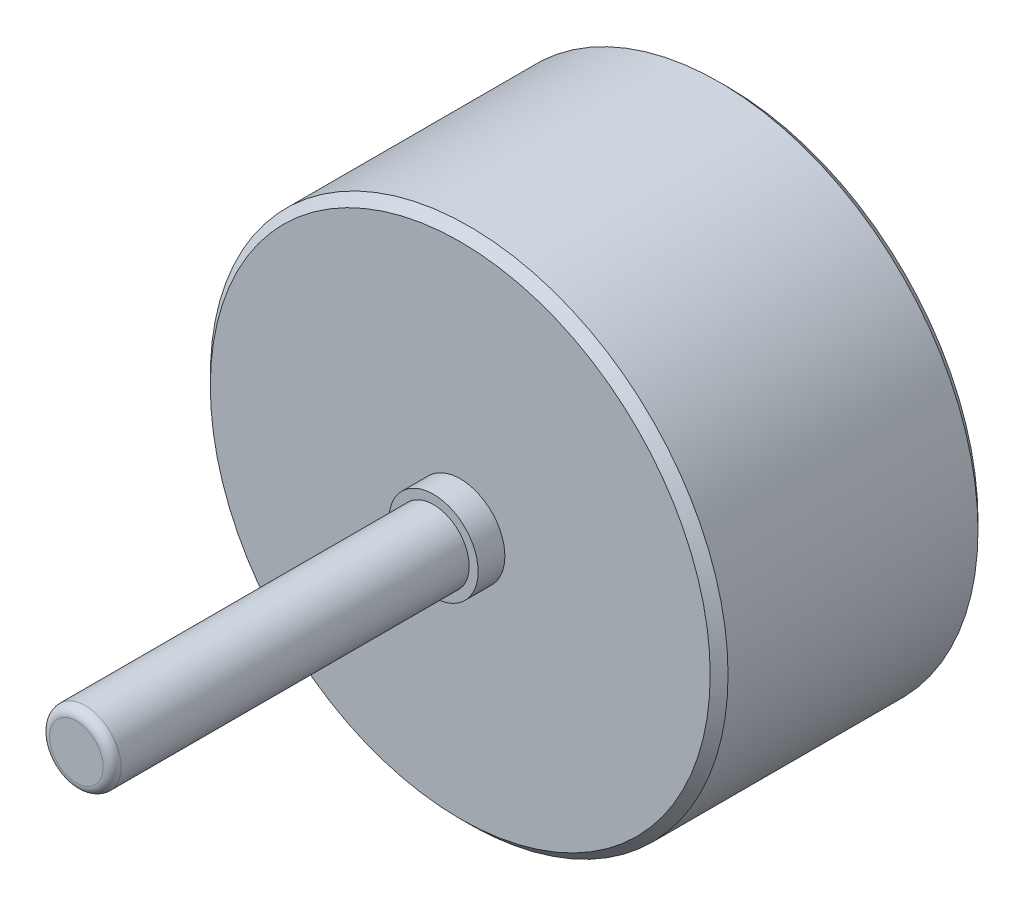
ISO-10303-21;
HEADER;
FILE_DESCRIPTION(('STEP AP214'),'2;1');
FILE_NAME('part.step','',(''),(''),'','','');
FILE_SCHEMA(('AUTOMOTIVE_DESIGN { 1 0 10303 214 1 1 1 1 }'));
ENDSEC;
DATA;
#1=APPLICATION_CONTEXT('core data for automotive mechanical design processes');
#2=APPLICATION_PROTOCOL_DEFINITION('international standard','automotive_design',2000,#1);
#3=PRODUCT_CONTEXT('',#1,'mechanical');
#4=PRODUCT('Part','Part','',(#3));
#5=PRODUCT_RELATED_PRODUCT_CATEGORY('part','',(#4));
#6=PRODUCT_DEFINITION_FORMATION('','',#4);
#7=PRODUCT_DEFINITION_CONTEXT('part definition',#1,'design');
#8=PRODUCT_DEFINITION('design','',#6,#7);
#9=PRODUCT_DEFINITION_SHAPE('','',#8);
#10=(LENGTH_UNIT() NAMED_UNIT(*) SI_UNIT(.MILLI.,.METRE.));
#11=(NAMED_UNIT(*) PLANE_ANGLE_UNIT() SI_UNIT($,.RADIAN.));
#12=(NAMED_UNIT(*) SI_UNIT($,.STERADIAN.) SOLID_ANGLE_UNIT());
#13=UNCERTAINTY_MEASURE_WITH_UNIT(LENGTH_MEASURE(1.E-05),#10,'distance_accuracy_value','');
#14=(GEOMETRIC_REPRESENTATION_CONTEXT(3) GLOBAL_UNCERTAINTY_ASSIGNED_CONTEXT((#13)) GLOBAL_UNIT_ASSIGNED_CONTEXT((#10,
#11,#12)) REPRESENTATION_CONTEXT('',''));
#15=CARTESIAN_POINT('',(0.,0.,0.));
#16=DIRECTION('',(0.,0.,1.));
#17=DIRECTION('',(1.,0.,0.));
#18=AXIS2_PLACEMENT_3D('',#15,#16,#17);
#19=CARTESIAN_POINT('',(0.,0.,30.));
#20=DIRECTION('',(0.,0.,-1.));
#21=DIRECTION('',(-1.,0.,0.));
#22=AXIS2_PLACEMENT_3D('',#19,#20,#21);
#23=CYLINDRICAL_SURFACE('',#22,29.);
#24=CARTESIAN_POINT('',(0.,0.,29.));
#25=DIRECTION('',(0.,0.,1.));
#26=DIRECTION('',(1.,0.,0.));
#27=AXIS2_PLACEMENT_3D('',#24,#25,#26);
#28=CIRCLE('',#27,29.);
#29=CARTESIAN_POINT('',(29.,0.,29.));
#30=VERTEX_POINT('',#29);
#31=EDGE_CURVE('E50',#30,#30,#28,.F.);
#32=ORIENTED_EDGE('',*,*,#31,.T.);
#33=EDGE_LOOP('',(#32));
#34=FACE_BOUND('',#33,.T.);
#35=CARTESIAN_POINT('',(0.,0.,1.00000000000001));
#36=DIRECTION('',(0.,0.,1.));
#37=DIRECTION('',(1.,0.,0.));
#38=AXIS2_PLACEMENT_3D('',#35,#36,#37);
#39=CIRCLE('',#38,29.);
#40=CARTESIAN_POINT('',(29.,0.,1.00000000000001));
#41=VERTEX_POINT('',#40);
#42=EDGE_CURVE('E55',#41,#41,#39,.T.);
#43=ORIENTED_EDGE('',*,*,#42,.T.);
#44=EDGE_LOOP('',(#43));
#45=FACE_BOUND('',#44,.T.);
#46=ADVANCED_FACE('F35',(#34,#45),#23,.T.);
#47=CARTESIAN_POINT('',(0.,0.,30.));
#48=DIRECTION('',(0.,0.,1.));
#49=DIRECTION('',(1.,0.,0.));
#50=AXIS2_PLACEMENT_3D('',#47,#48,#49);
#51=PLANE('',#50);
#52=CARTESIAN_POINT('',(0.,0.,30.));
#53=DIRECTION('',(0.,0.,1.));
#54=DIRECTION('',(1.,0.,0.));
#55=AXIS2_PLACEMENT_3D('',#52,#53,#54);
#56=CIRCLE('',#55,28.);
#57=CARTESIAN_POINT('',(28.,0.,30.));
#58=VERTEX_POINT('',#57);
#59=EDGE_CURVE('E58',#58,#58,#56,.T.);
#60=ORIENTED_EDGE('',*,*,#59,.T.);
#61=EDGE_LOOP('',(#60));
#62=FACE_BOUND('',#61,.T.);
#63=CARTESIAN_POINT('',(0.,0.,30.));
#64=DIRECTION('',(0.,0.,1.));
#65=DIRECTION('',(1.,0.,0.));
#66=AXIS2_PLACEMENT_3D('',#63,#64,#65);
#67=CIRCLE('',#66,5.);
#68=CARTESIAN_POINT('',(5.,0.,30.));
#69=VERTEX_POINT('',#68);
#70=EDGE_CURVE('E65',#69,#69,#67,.T.);
#71=ORIENTED_EDGE('',*,*,#70,.F.);
#72=EDGE_LOOP('',(#71));
#73=FACE_BOUND('',#72,.T.);
#74=ADVANCED_FACE('F89',(#62,#73),#51,.T.);
#75=CARTESIAN_POINT('',(0.,0.,0.));
#76=DIRECTION('',(0.,0.,1.));
#77=DIRECTION('',(1.,0.,0.));
#78=AXIS2_PLACEMENT_3D('',#75,#76,#77);
#79=PLANE('',#78);
#80=CARTESIAN_POINT('',(0.,0.,0.));
#81=DIRECTION('',(0.,0.,1.));
#82=DIRECTION('',(1.,0.,0.));
#83=AXIS2_PLACEMENT_3D('',#80,#81,#82);
#84=CIRCLE('',#83,28.);
#85=CARTESIAN_POINT('',(28.,0.,0.));
#86=VERTEX_POINT('',#85);
#87=EDGE_CURVE('E46',#86,#86,#84,.F.);
#88=ORIENTED_EDGE('',*,*,#87,.T.);
#89=EDGE_LOOP('',(#88));
#90=FACE_BOUND('',#89,.T.);
#91=CARTESIAN_POINT('',(0.,0.,0.));
#92=DIRECTION('',(0.,0.,-1.));
#93=DIRECTION('',(-1.,0.,0.));
#94=AXIS2_PLACEMENT_3D('',#91,#92,#93);
#95=CIRCLE('',#94,4.);
#96=CARTESIAN_POINT('',(-4.,0.,0.));
#97=VERTEX_POINT('',#96);
#98=EDGE_CURVE('E71',#97,#97,#95,.T.);
#99=ORIENTED_EDGE('',*,*,#98,.F.);
#100=EDGE_LOOP('',(#99));
#101=FACE_BOUND('',#100,.T.);
#102=ADVANCED_FACE('F86',(#90,#101),#79,.F.);
#103=CARTESIAN_POINT('',(0.,0.,33.));
#104=DIRECTION('',(0.,0.,-1.));
#105=DIRECTION('',(-1.,0.,0.));
#106=AXIS2_PLACEMENT_3D('',#103,#104,#105);
#107=CYLINDRICAL_SURFACE('',#106,5.);
#108=CARTESIAN_POINT('',(0.,0.,33.));
#109=DIRECTION('',(0.,0.,1.));
#110=DIRECTION('',(1.,0.,0.));
#111=AXIS2_PLACEMENT_3D('',#108,#109,#110);
#112=CIRCLE('',#111,5.);
#113=CARTESIAN_POINT('',(5.,0.,33.));
#114=VERTEX_POINT('',#113);
#115=EDGE_CURVE('E64',#114,#114,#112,.T.);
#116=ORIENTED_EDGE('',*,*,#115,.F.);
#117=EDGE_LOOP('',(#116));
#118=FACE_BOUND('',#117,.T.);
#119=ORIENTED_EDGE('',*,*,#70,.T.);
#120=EDGE_LOOP('',(#119));
#121=FACE_BOUND('',#120,.T.);
#122=ADVANCED_FACE('F88',(#118,#121),#107,.T.);
#123=CARTESIAN_POINT('',(0.,0.,33.));
#124=DIRECTION('',(0.,0.,1.));
#125=DIRECTION('',(1.,0.,0.));
#126=AXIS2_PLACEMENT_3D('',#123,#124,#125);
#127=PLANE('',#126);
#128=CARTESIAN_POINT('',(0.,0.,33.));
#129=DIRECTION('',(0.,0.,1.));
#130=DIRECTION('',(1.,0.,0.));
#131=AXIS2_PLACEMENT_3D('',#128,#129,#130);
#132=CIRCLE('',#131,4.);
#133=CARTESIAN_POINT('',(4.,0.,33.));
#134=VERTEX_POINT('',#133);
#135=EDGE_CURVE('E61',#134,#134,#132,.T.);
#136=ORIENTED_EDGE('',*,*,#135,.F.);
#137=EDGE_LOOP('',(#136));
#138=FACE_BOUND('',#137,.T.);
#139=ORIENTED_EDGE('',*,*,#115,.T.);
#140=EDGE_LOOP('',(#139));
#141=FACE_BOUND('',#140,.T.);
#142=ADVANCED_FACE('F96',(#138,#141),#127,.T.);
#143=CARTESIAN_POINT('',(0.,0.,40.25));
#144=DIRECTION('',(0.,0.,-1.));
#145=DIRECTION('',(-1.,0.,0.));
#146=AXIS2_PLACEMENT_3D('',#143,#144,#145);
#147=CYLINDRICAL_SURFACE('',#146,4.);
#148=CARTESIAN_POINT('',(0.,0.,72.));
#149=DIRECTION('',(0.,0.,1.));
#150=DIRECTION('',(1.,0.,0.));
#151=AXIS2_PLACEMENT_3D('',#148,#149,#150);
#152=CIRCLE('',#151,4.);
#153=CARTESIAN_POINT('',(4.,0.,72.));
#154=VERTEX_POINT('',#153);
#155=EDGE_CURVE('E10',#154,#154,#152,.F.);
#156=ORIENTED_EDGE('',*,*,#155,.T.);
#157=EDGE_LOOP('',(#156));
#158=FACE_BOUND('',#157,.T.);
#159=ORIENTED_EDGE('',*,*,#135,.T.);
#160=EDGE_LOOP('',(#159));
#161=FACE_BOUND('',#160,.T.);
#162=ADVANCED_FACE('F82',(#158,#161),#147,.T.);
#163=CARTESIAN_POINT('',(0.,0.,5.));
#164=DIRECTION('',(0.,0.,-1.));
#165=DIRECTION('',(-1.,0.,0.));
#166=AXIS2_PLACEMENT_3D('',#163,#164,#165);
#167=CYLINDRICAL_SURFACE('',#166,4.);
#168=CARTESIAN_POINT('',(0.,0.,5.));
#169=DIRECTION('',(0.,0.,-1.));
#170=DIRECTION('',(-1.,0.,0.));
#171=AXIS2_PLACEMENT_3D('',#168,#169,#170);
#172=CIRCLE('',#171,4.);
#173=CARTESIAN_POINT('',(-4.,0.,5.));
#174=VERTEX_POINT('',#173);
#175=EDGE_CURVE('E68',#174,#174,#172,.T.);
#176=ORIENTED_EDGE('',*,*,#175,.F.);
#177=EDGE_LOOP('',(#176));
#178=FACE_BOUND('',#177,.T.);
#179=ORIENTED_EDGE('',*,*,#98,.T.);
#180=EDGE_LOOP('',(#179));
#181=FACE_BOUND('',#180,.T.);
#182=ADVANCED_FACE('F79',(#178,#181),#167,.F.);
#183=CARTESIAN_POINT('',(0.,0.,5.));
#184=DIRECTION('',(0.,0.,-1.));
#185=DIRECTION('',(-1.,0.,0.));
#186=AXIS2_PLACEMENT_3D('',#183,#184,#185);
#187=PLANE('',#186);
#188=ORIENTED_EDGE('',*,*,#175,.T.);
#189=EDGE_LOOP('',(#188));
#190=FACE_BOUND('',#189,.T.);
#191=ADVANCED_FACE('F77',(#190),#187,.T.);
#192=CARTESIAN_POINT('',(0.,0.,30.));
#193=DIRECTION('',(0.,0.,-1.));
#194=DIRECTION('',(-1.,0.,0.));
#195=AXIS2_PLACEMENT_3D('',#192,#193,#194);
#196=CONICAL_SURFACE('',#195,28.,0.785398163397452);
#197=ORIENTED_EDGE('',*,*,#31,.F.);
#198=EDGE_LOOP('',(#197));
#199=FACE_BOUND('',#198,.T.);
#200=ORIENTED_EDGE('',*,*,#59,.F.);
#201=EDGE_LOOP('',(#200));
#202=FACE_BOUND('',#201,.T.);
#203=ADVANCED_FACE('F108',(#199,#202),#196,.T.);
#204=CARTESIAN_POINT('',(0.,0.,1.00000000000001));
#205=DIRECTION('',(0.,0.,1.));
#206=DIRECTION('',(1.,0.,0.));
#207=AXIS2_PLACEMENT_3D('',#204,#205,#206);
#208=CONICAL_SURFACE('',#207,29.,0.78539816339745);
#209=ORIENTED_EDGE('',*,*,#87,.F.);
#210=EDGE_LOOP('',(#209));
#211=FACE_BOUND('',#210,.T.);
#212=ORIENTED_EDGE('',*,*,#42,.F.);
#213=EDGE_LOOP('',(#212));
#214=FACE_BOUND('',#213,.T.);
#215=ADVANCED_FACE('F110',(#211,#214),#208,.T.);
#216=CARTESIAN_POINT('',(0.,0.,73.));
#217=DIRECTION('',(0.,0.,1.));
#218=DIRECTION('',(1.,0.,0.));
#219=AXIS2_PLACEMENT_3D('',#216,#217,#218);
#220=PLANE('',#219);
#221=CARTESIAN_POINT('',(0.,0.,73.));
#222=DIRECTION('',(0.,0.,1.));
#223=DIRECTION('',(1.,0.,0.));
#224=AXIS2_PLACEMENT_3D('',#221,#222,#223);
#225=CIRCLE('',#224,3.);
#226=CARTESIAN_POINT('',(3.,0.,73.));
#227=VERTEX_POINT('',#226);
#228=EDGE_CURVE('E42',#227,#227,#225,.T.);
#229=ORIENTED_EDGE('',*,*,#228,.T.);
#230=EDGE_LOOP('',(#229));
#231=FACE_BOUND('',#230,.T.);
#232=ADVANCED_FACE('F113',(#231),#220,.T.);
#233=CARTESIAN_POINT('',(0.,0.,72.));
#234=DIRECTION('',(0.,0.,1.));
#235=DIRECTION('',(1.,0.,0.));
#236=AXIS2_PLACEMENT_3D('',#233,#234,#235);
#237=TOROIDAL_SURFACE('',#236,3.,1.);
#238=ORIENTED_EDGE('',*,*,#155,.F.);
#239=EDGE_LOOP('',(#238));
#240=FACE_BOUND('',#239,.T.);
#241=ORIENTED_EDGE('',*,*,#228,.F.);
#242=EDGE_LOOP('',(#241));
#243=FACE_BOUND('',#242,.T.);
#244=ADVANCED_FACE('F37',(#240,#243),#237,.T.);
#245=CLOSED_SHELL('',(#46,#74,#102,#122,#142,#162,#182,#191,#203,#215,#232,#244));
#246=MANIFOLD_SOLID_BREP('B2',#245);
#247=ADVANCED_BREP_SHAPE_REPRESENTATION('',(#18,#246),#14);
#248=SHAPE_DEFINITION_REPRESENTATION(#9,#247);
ENDSEC;
END-ISO-10303-21;
